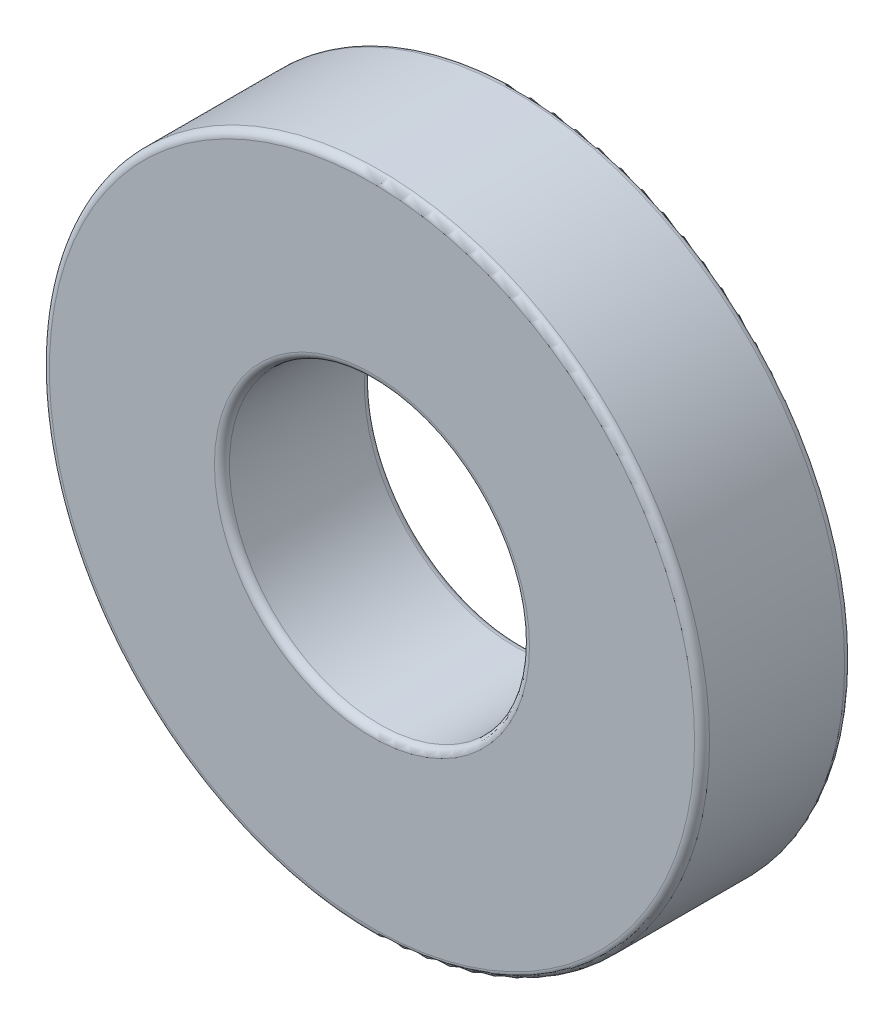
ISO-10303-21;
HEADER;
FILE_DESCRIPTION(('STEP AP214'),'2;1');
FILE_NAME('part.step','',(''),(''),'','','');
FILE_SCHEMA(('AUTOMOTIVE_DESIGN { 1 0 10303 214 1 1 1 1 }'));
ENDSEC;
DATA;
#1=APPLICATION_CONTEXT('core data for automotive mechanical design processes');
#2=APPLICATION_PROTOCOL_DEFINITION('international standard','automotive_design',2000,#1);
#3=PRODUCT_CONTEXT('',#1,'mechanical');
#4=PRODUCT('Part','Part','',(#3));
#5=PRODUCT_RELATED_PRODUCT_CATEGORY('part','',(#4));
#6=PRODUCT_DEFINITION_FORMATION('','',#4);
#7=PRODUCT_DEFINITION_CONTEXT('part definition',#1,'design');
#8=PRODUCT_DEFINITION('design','',#6,#7);
#9=PRODUCT_DEFINITION_SHAPE('','',#8);
#10=(LENGTH_UNIT() NAMED_UNIT(*) SI_UNIT(.MILLI.,.METRE.));
#11=(NAMED_UNIT(*) PLANE_ANGLE_UNIT() SI_UNIT($,.RADIAN.));
#12=(NAMED_UNIT(*) SI_UNIT($,.STERADIAN.) SOLID_ANGLE_UNIT());
#13=UNCERTAINTY_MEASURE_WITH_UNIT(LENGTH_MEASURE(1.E-05),#10,'distance_accuracy_value','');
#14=(GEOMETRIC_REPRESENTATION_CONTEXT(3) GLOBAL_UNCERTAINTY_ASSIGNED_CONTEXT((#13)) GLOBAL_UNIT_ASSIGNED_CONTEXT((#10,
#11,#12)) REPRESENTATION_CONTEXT('',''));
#15=CARTESIAN_POINT('',(0.,0.,0.));
#16=DIRECTION('',(0.,0.,1.));
#17=DIRECTION('',(1.,0.,0.));
#18=AXIS2_PLACEMENT_3D('',#15,#16,#17);
#19=CARTESIAN_POINT('',(0.,0.,1.));
#20=DIRECTION('',(0.,0.,1.));
#21=DIRECTION('',(1.,0.,0.));
#22=AXIS2_PLACEMENT_3D('',#19,#20,#21);
#23=PLANE('',#22);
#24=CARTESIAN_POINT('',(0.,0.,1.));
#25=DIRECTION('',(0.,0.,1.));
#26=DIRECTION('',(1.,0.,0.));
#27=AXIS2_PLACEMENT_3D('',#24,#25,#26);
#28=CIRCLE('',#27,1.05);
#29=CARTESIAN_POINT('',(1.05,0.,1.));
#30=VERTEX_POINT('',#29);
#31=EDGE_CURVE('E42',#30,#30,#28,.F.);
#32=ORIENTED_EDGE('',*,*,#31,.T.);
#33=EDGE_LOOP('',(#32));
#34=FACE_BOUND('',#33,.T.);
#35=CARTESIAN_POINT('',(0.,0.,1.));
#36=DIRECTION('',(0.,0.,1.));
#37=DIRECTION('',(1.,0.,0.));
#38=AXIS2_PLACEMENT_3D('',#35,#36,#37);
#39=CIRCLE('',#38,2.15);
#40=CARTESIAN_POINT('',(2.15,0.,1.));
#41=VERTEX_POINT('',#40);
#42=EDGE_CURVE('E46',#41,#41,#39,.T.);
#43=ORIENTED_EDGE('',*,*,#42,.T.);
#44=EDGE_LOOP('',(#43));
#45=FACE_BOUND('',#44,.T.);
#46=ADVANCED_FACE('F31',(#34,#45),#23,.T.);
#47=CARTESIAN_POINT('',(0.,0.,0.));
#48=DIRECTION('',(0.,0.,1.));
#49=DIRECTION('',(1.,0.,0.));
#50=AXIS2_PLACEMENT_3D('',#47,#48,#49);
#51=PLANE('',#50);
#52=CARTESIAN_POINT('',(0.,0.,0.));
#53=DIRECTION('',(0.,0.,1.));
#54=DIRECTION('',(1.,0.,0.));
#55=AXIS2_PLACEMENT_3D('',#52,#53,#54);
#56=CIRCLE('',#55,1.05);
#57=CARTESIAN_POINT('',(1.05,0.,0.));
#58=VERTEX_POINT('',#57);
#59=EDGE_CURVE('E57',#58,#58,#56,.T.);
#60=ORIENTED_EDGE('',*,*,#59,.T.);
#61=EDGE_LOOP('',(#60));
#62=FACE_BOUND('',#61,.T.);
#63=CARTESIAN_POINT('',(0.,0.,0.));
#64=DIRECTION('',(0.,0.,1.));
#65=DIRECTION('',(1.,0.,0.));
#66=AXIS2_PLACEMENT_3D('',#63,#64,#65);
#67=CIRCLE('',#66,2.15);
#68=CARTESIAN_POINT('',(2.15,0.,0.));
#69=VERTEX_POINT('',#68);
#70=EDGE_CURVE('E60',#69,#69,#67,.F.);
#71=ORIENTED_EDGE('',*,*,#70,.T.);
#72=EDGE_LOOP('',(#71));
#73=FACE_BOUND('',#72,.T.);
#74=ADVANCED_FACE('F64',(#62,#73),#51,.F.);
#75=CARTESIAN_POINT('',(0.,0.,1.));
#76=DIRECTION('',(0.,0.,-1.));
#77=DIRECTION('',(-1.,0.,0.));
#78=AXIS2_PLACEMENT_3D('',#75,#76,#77);
#79=CYLINDRICAL_SURFACE('',#78,2.2);
#80=CARTESIAN_POINT('',(0.,0.,0.05));
#81=DIRECTION('',(0.,0.,1.));
#82=DIRECTION('',(1.,0.,0.));
#83=AXIS2_PLACEMENT_3D('',#80,#81,#82);
#84=CIRCLE('',#83,2.2);
#85=CARTESIAN_POINT('',(2.2,0.,0.05));
#86=VERTEX_POINT('',#85);
#87=EDGE_CURVE('E10',#86,#86,#84,.T.);
#88=ORIENTED_EDGE('',*,*,#87,.T.);
#89=EDGE_LOOP('',(#88));
#90=FACE_BOUND('',#89,.T.);
#91=CARTESIAN_POINT('',(0.,0.,0.95));
#92=DIRECTION('',(0.,0.,1.));
#93=DIRECTION('',(1.,0.,0.));
#94=AXIS2_PLACEMENT_3D('',#91,#92,#93);
#95=CIRCLE('',#94,2.2);
#96=CARTESIAN_POINT('',(2.2,0.,0.95));
#97=VERTEX_POINT('',#96);
#98=EDGE_CURVE('E38',#97,#97,#95,.F.);
#99=ORIENTED_EDGE('',*,*,#98,.T.);
#100=EDGE_LOOP('',(#99));
#101=FACE_BOUND('',#100,.T.);
#102=ADVANCED_FACE('F84',(#90,#101),#79,.T.);
#103=CARTESIAN_POINT('',(0.,0.,1.));
#104=DIRECTION('',(0.,0.,-1.));
#105=DIRECTION('',(-1.,0.,0.));
#106=AXIS2_PLACEMENT_3D('',#103,#104,#105);
#107=CYLINDRICAL_SURFACE('',#106,1.);
#108=CARTESIAN_POINT('',(0.,0.,0.05));
#109=DIRECTION('',(0.,0.,1.));
#110=DIRECTION('',(1.,0.,0.));
#111=AXIS2_PLACEMENT_3D('',#108,#109,#110);
#112=CIRCLE('',#111,1.);
#113=CARTESIAN_POINT('',(1.,0.,0.05));
#114=VERTEX_POINT('',#113);
#115=EDGE_CURVE('E51',#114,#114,#112,.F.);
#116=ORIENTED_EDGE('',*,*,#115,.T.);
#117=EDGE_LOOP('',(#116));
#118=FACE_BOUND('',#117,.T.);
#119=CARTESIAN_POINT('',(0.,0.,0.95));
#120=DIRECTION('',(0.,0.,1.));
#121=DIRECTION('',(1.,0.,0.));
#122=AXIS2_PLACEMENT_3D('',#119,#120,#121);
#123=CIRCLE('',#122,1.);
#124=CARTESIAN_POINT('',(1.,0.,0.95));
#125=VERTEX_POINT('',#124);
#126=EDGE_CURVE('E54',#125,#125,#123,.T.);
#127=ORIENTED_EDGE('',*,*,#126,.T.);
#128=EDGE_LOOP('',(#127));
#129=FACE_BOUND('',#128,.T.);
#130=ADVANCED_FACE('F89',(#118,#129),#107,.F.);
#131=CARTESIAN_POINT('',(0.,0.,0.05));
#132=DIRECTION('',(0.,0.,1.));
#133=DIRECTION('',(1.,0.,0.));
#134=AXIS2_PLACEMENT_3D('',#131,#132,#133);
#135=TOROIDAL_SURFACE('',#134,1.05,0.05);
#136=ORIENTED_EDGE('',*,*,#115,.F.);
#137=EDGE_LOOP('',(#136));
#138=FACE_BOUND('',#137,.T.);
#139=ORIENTED_EDGE('',*,*,#59,.F.);
#140=EDGE_LOOP('',(#139));
#141=FACE_BOUND('',#140,.T.);
#142=ADVANCED_FACE('F75',(#138,#141),#135,.T.);
#143=CARTESIAN_POINT('',(0.,0.,0.95));
#144=DIRECTION('',(0.,0.,1.));
#145=DIRECTION('',(1.,0.,0.));
#146=AXIS2_PLACEMENT_3D('',#143,#144,#145);
#147=TOROIDAL_SURFACE('',#146,1.05,0.05);
#148=ORIENTED_EDGE('',*,*,#31,.F.);
#149=EDGE_LOOP('',(#148));
#150=FACE_BOUND('',#149,.T.);
#151=ORIENTED_EDGE('',*,*,#126,.F.);
#152=EDGE_LOOP('',(#151));
#153=FACE_BOUND('',#152,.T.);
#154=ADVANCED_FACE('F69',(#150,#153),#147,.T.);
#155=CARTESIAN_POINT('',(0.,0.,0.05));
#156=DIRECTION('',(0.,0.,1.));
#157=DIRECTION('',(1.,0.,0.));
#158=AXIS2_PLACEMENT_3D('',#155,#156,#157);
#159=TOROIDAL_SURFACE('',#158,2.15,0.05);
#160=ORIENTED_EDGE('',*,*,#70,.F.);
#161=EDGE_LOOP('',(#160));
#162=FACE_BOUND('',#161,.T.);
#163=ORIENTED_EDGE('',*,*,#87,.F.);
#164=EDGE_LOOP('',(#163));
#165=FACE_BOUND('',#164,.T.);
#166=ADVANCED_FACE('F66',(#162,#165),#159,.T.);
#167=CARTESIAN_POINT('',(0.,0.,0.95));
#168=DIRECTION('',(0.,0.,1.));
#169=DIRECTION('',(1.,0.,0.));
#170=AXIS2_PLACEMENT_3D('',#167,#168,#169);
#171=TOROIDAL_SURFACE('',#170,2.15,0.05);
#172=ORIENTED_EDGE('',*,*,#98,.F.);
#173=EDGE_LOOP('',(#172));
#174=FACE_BOUND('',#173,.T.);
#175=ORIENTED_EDGE('',*,*,#42,.F.);
#176=EDGE_LOOP('',(#175));
#177=FACE_BOUND('',#176,.T.);
#178=ADVANCED_FACE('F33',(#174,#177),#171,.T.);
#179=CLOSED_SHELL('',(#46,#74,#102,#130,#142,#154,#166,#178));
#180=MANIFOLD_SOLID_BREP('B2',#179);
#181=ADVANCED_BREP_SHAPE_REPRESENTATION('',(#18,#180),#14);
#182=SHAPE_DEFINITION_REPRESENTATION(#9,#181);
ENDSEC;
END-ISO-10303-21;
